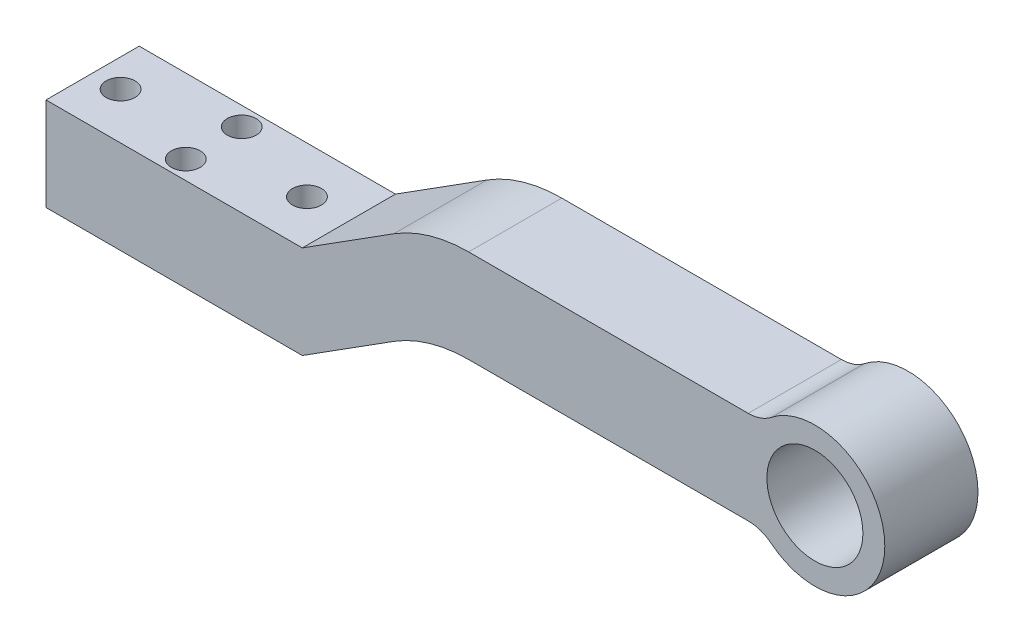
ISO-10303-21;
HEADER;
FILE_DESCRIPTION(('STEP AP214'),'2;1');
FILE_NAME('part.step','',(''),(''),'','','');
FILE_SCHEMA(('AUTOMOTIVE_DESIGN { 1 0 10303 214 1 1 1 1 }'));
ENDSEC;
DATA;
#1=APPLICATION_CONTEXT('core data for automotive mechanical design processes');
#2=APPLICATION_PROTOCOL_DEFINITION('international standard','automotive_design',2000,#1);
#3=PRODUCT_CONTEXT('',#1,'mechanical');
#4=PRODUCT('Part','Part','',(#3));
#5=PRODUCT_RELATED_PRODUCT_CATEGORY('part','',(#4));
#6=PRODUCT_DEFINITION_FORMATION('','',#4);
#7=PRODUCT_DEFINITION_CONTEXT('part definition',#1,'design');
#8=PRODUCT_DEFINITION('design','',#6,#7);
#9=PRODUCT_DEFINITION_SHAPE('','',#8);
#10=(LENGTH_UNIT() NAMED_UNIT(*) SI_UNIT(.MILLI.,.METRE.));
#11=(NAMED_UNIT(*) PLANE_ANGLE_UNIT() SI_UNIT($,.RADIAN.));
#12=(NAMED_UNIT(*) SI_UNIT($,.STERADIAN.) SOLID_ANGLE_UNIT());
#13=UNCERTAINTY_MEASURE_WITH_UNIT(LENGTH_MEASURE(1.E-05),#10,'distance_accuracy_value','');
#14=(GEOMETRIC_REPRESENTATION_CONTEXT(3) GLOBAL_UNCERTAINTY_ASSIGNED_CONTEXT((#13)) GLOBAL_UNIT_ASSIGNED_CONTEXT((#10,
#11,#12)) REPRESENTATION_CONTEXT('',''));
#15=CARTESIAN_POINT('',(0.,0.,0.));
#16=DIRECTION('',(0.,0.,1.));
#17=DIRECTION('',(1.,0.,0.));
#18=AXIS2_PLACEMENT_3D('',#15,#16,#17);
#19=CARTESIAN_POINT('',(197.237796850758,292.623912246658,4.));
#20=DIRECTION('',(0.,-1.,0.));
#21=DIRECTION('',(0.,0.,-1.));
#22=AXIS2_PLACEMENT_3D('',#19,#20,#21);
#23=CYLINDRICAL_SURFACE('',#22,1.59999999999999);
#24=CARTESIAN_POINT('',(197.237796850758,270.623912246657,4.));
#25=DIRECTION('',(0.,-1.,0.));
#26=DIRECTION('',(0.,0.,-1.));
#27=AXIS2_PLACEMENT_3D('',#24,#25,#26);
#28=CIRCLE('',#27,1.59999999999999);
#29=CARTESIAN_POINT('',(197.237796850758,270.623912246657,2.40000000000001));
#30=VERTEX_POINT('',#29);
#31=EDGE_CURVE('E205',#30,#30,#28,.T.);
#32=ORIENTED_EDGE('',*,*,#31,.T.);
#33=EDGE_LOOP('',(#32));
#34=FACE_BOUND('',#33,.T.);
#35=CARTESIAN_POINT('',(197.237796850758,281.623912246657,4.));
#36=DIRECTION('',(0.,1.,0.));
#37=DIRECTION('',(0.,0.,1.));
#38=AXIS2_PLACEMENT_3D('',#35,#36,#37);
#39=CIRCLE('',#38,1.59999999999999);
#40=CARTESIAN_POINT('',(197.237796850758,281.623912246657,5.59999999999999));
#41=VERTEX_POINT('',#40);
#42=EDGE_CURVE('E213',#41,#41,#39,.F.);
#43=ORIENTED_EDGE('',*,*,#42,.F.);
#44=EDGE_LOOP('',(#43));
#45=FACE_BOUND('',#44,.T.);
#46=ADVANCED_FACE('F35',(#34,#45),#23,.F.);
#47=CARTESIAN_POINT('',(197.237796850758,292.623912246658,16.));
#48=DIRECTION('',(0.,-1.,0.));
#49=DIRECTION('',(0.,0.,-1.));
#50=AXIS2_PLACEMENT_3D('',#47,#48,#49);
#51=CYLINDRICAL_SURFACE('',#50,1.59999999999999);
#52=CARTESIAN_POINT('',(197.237796850758,270.623912246657,16.));
#53=DIRECTION('',(0.,-1.,0.));
#54=DIRECTION('',(0.,0.,-1.));
#55=AXIS2_PLACEMENT_3D('',#52,#53,#54);
#56=CIRCLE('',#55,1.59999999999999);
#57=CARTESIAN_POINT('',(197.237796850758,270.623912246657,14.4));
#58=VERTEX_POINT('',#57);
#59=EDGE_CURVE('E230',#58,#58,#56,.T.);
#60=ORIENTED_EDGE('',*,*,#59,.T.);
#61=EDGE_LOOP('',(#60));
#62=FACE_BOUND('',#61,.T.);
#63=CARTESIAN_POINT('',(197.237796850758,281.623912246657,16.));
#64=DIRECTION('',(0.,1.,0.));
#65=DIRECTION('',(0.,0.,1.));
#66=AXIS2_PLACEMENT_3D('',#63,#64,#65);
#67=CIRCLE('',#66,1.59999999999999);
#68=CARTESIAN_POINT('',(197.237796850758,281.623912246657,17.6));
#69=VERTEX_POINT('',#68);
#70=EDGE_CURVE('E210',#69,#69,#67,.F.);
#71=ORIENTED_EDGE('',*,*,#70,.F.);
#72=EDGE_LOOP('',(#71));
#73=FACE_BOUND('',#72,.T.);
#74=ADVANCED_FACE('F307',(#62,#73),#51,.F.);
#75=CARTESIAN_POINT('',(217.237796850758,292.623912246658,10.));
#76=DIRECTION('',(0.,-1.,0.));
#77=DIRECTION('',(0.,0.,-1.));
#78=AXIS2_PLACEMENT_3D('',#75,#76,#77);
#79=CYLINDRICAL_SURFACE('',#78,1.59999999999999);
#80=CARTESIAN_POINT('',(217.237796850758,270.623912246657,10.));
#81=DIRECTION('',(0.,-1.,0.));
#82=DIRECTION('',(0.,0.,-1.));
#83=AXIS2_PLACEMENT_3D('',#80,#81,#82);
#84=CIRCLE('',#83,1.59999999999999);
#85=CARTESIAN_POINT('',(217.237796850758,270.623912246657,8.40000000000002));
#86=VERTEX_POINT('',#85);
#87=EDGE_CURVE('E226',#86,#86,#84,.T.);
#88=ORIENTED_EDGE('',*,*,#87,.T.);
#89=EDGE_LOOP('',(#88));
#90=FACE_BOUND('',#89,.T.);
#91=CARTESIAN_POINT('',(217.237796850758,281.623912246657,10.));
#92=DIRECTION('',(0.,1.,0.));
#93=DIRECTION('',(0.,0.,1.));
#94=AXIS2_PLACEMENT_3D('',#91,#92,#93);
#95=CIRCLE('',#94,1.59999999999999);
#96=CARTESIAN_POINT('',(217.237796850758,281.623912246657,11.6));
#97=VERTEX_POINT('',#96);
#98=EDGE_CURVE('E207',#97,#97,#95,.F.);
#99=ORIENTED_EDGE('',*,*,#98,.F.);
#100=EDGE_LOOP('',(#99));
#101=FACE_BOUND('',#100,.T.);
#102=ADVANCED_FACE('F313',(#90,#101),#79,.F.);
#103=CARTESIAN_POINT('',(177.237796850758,292.623912246658,10.));
#104=DIRECTION('',(0.,-1.,0.));
#105=DIRECTION('',(0.,0.,-1.));
#106=AXIS2_PLACEMENT_3D('',#103,#104,#105);
#107=CYLINDRICAL_SURFACE('',#106,1.59999999999999);
#108=CARTESIAN_POINT('',(177.237796850758,270.623912246657,10.));
#109=DIRECTION('',(0.,-1.,0.));
#110=DIRECTION('',(0.,0.,-1.));
#111=AXIS2_PLACEMENT_3D('',#108,#109,#110);
#112=CIRCLE('',#111,1.59999999999999);
#113=CARTESIAN_POINT('',(177.237796850758,270.623912246657,8.40000000000001));
#114=VERTEX_POINT('',#113);
#115=EDGE_CURVE('E229',#114,#114,#112,.T.);
#116=ORIENTED_EDGE('',*,*,#115,.T.);
#117=EDGE_LOOP('',(#116));
#118=FACE_BOUND('',#117,.T.);
#119=CARTESIAN_POINT('',(177.237796850758,281.623912246657,10.));
#120=DIRECTION('',(0.,1.,0.));
#121=DIRECTION('',(0.,0.,1.));
#122=AXIS2_PLACEMENT_3D('',#119,#120,#121);
#123=CIRCLE('',#122,1.59999999999999);
#124=CARTESIAN_POINT('',(177.237796850758,281.623912246657,11.6));
#125=VERTEX_POINT('',#124);
#126=EDGE_CURVE('E202',#125,#125,#123,.F.);
#127=ORIENTED_EDGE('',*,*,#126,.F.);
#128=EDGE_LOOP('',(#127));
#129=FACE_BOUND('',#128,.T.);
#130=ADVANCED_FACE('F319',(#118,#129),#107,.F.);
#131=CARTESIAN_POINT('',(321.918709695082,279.724919412941,20.));
#132=DIRECTION('',(0.,0.,1.));
#133=DIRECTION('',(1.,0.,0.));
#134=AXIS2_PLACEMENT_3D('',#131,#132,#133);
#135=PLANE('',#134);
#136=DIRECTION('',(0.,1.,0.));
#137=VECTOR('',#136,1.);
#138=CARTESIAN_POINT('',(171.237796850758,268.623912246657,20.));
#139=LINE('',#138,#137);
#140=CARTESIAN_POINT('',(171.237796850758,270.623912246657,20.));
#141=VERTEX_POINT('',#140);
#142=CARTESIAN_POINT('',(171.237796850758,290.623912246657,20.));
#143=VERTEX_POINT('',#142);
#144=EDGE_CURVE('E257',#141,#143,#139,.T.);
#145=ORIENTED_EDGE('',*,*,#144,.F.);
#146=DIRECTION('',(1.,0.,0.));
#147=VECTOR('',#146,1.);
#148=CARTESIAN_POINT('',(168.237796850758,270.623912246657,20.));
#149=LINE('',#148,#147);
#150=CARTESIAN_POINT('',(226.237796850758,270.623912246657,20.));
#151=VERTEX_POINT('',#150);
#152=EDGE_CURVE('E136',#141,#151,#149,.T.);
#153=ORIENTED_EDGE('',*,*,#152,.T.);
#154=DIRECTION('',(0.844667068226223,0.535292017364463,0.));
#155=VECTOR('',#154,1.);
#156=CARTESIAN_POINT('',(245.869173526594,283.064931459728,20.));
#157=LINE('',#156,#155);
#158=CARTESIAN_POINT('',(245.869173526594,283.064931459728,20.));
#159=VERTEX_POINT('',#158);
#160=EDGE_CURVE('E127',#151,#159,#157,.T.);
#161=ORIENTED_EDGE('',*,*,#160,.T.);
#162=CARTESIAN_POINT('',(261.927934047528,257.724919412941,20.));
#163=DIRECTION('',(0.,0.,-1.));
#164=DIRECTION('',(1.,0.,0.));
#165=AXIS2_PLACEMENT_3D('',#162,#163,#164);
#166=CIRCLE('',#165,30.);
#167=CARTESIAN_POINT('',(261.927934047528,287.724919412941,20.));
#168=VERTEX_POINT('',#167);
#169=EDGE_CURVE('E133',#159,#168,#166,.T.);
#170=ORIENTED_EDGE('',*,*,#169,.T.);
#171=DIRECTION('',(1.,0.,0.));
#172=VECTOR('',#171,1.);
#173=CARTESIAN_POINT('',(261.927934047528,287.724919412941,20.));
#174=LINE('',#173,#172);
#175=CARTESIAN_POINT('',(321.918709695082,287.724919412941,20.));
#176=VERTEX_POINT('',#175);
#177=EDGE_CURVE('E58',#168,#176,#174,.T.);
#178=ORIENTED_EDGE('',*,*,#177,.T.);
#179=CARTESIAN_POINT('',(321.918709695082,279.724919412941,20.));
#180=DIRECTION('',(0.,0.,-1.));
#181=DIRECTION('',(1.,0.,0.));
#182=AXIS2_PLACEMENT_3D('',#179,#180,#181);
#183=CIRCLE('',#182,7.99999999999997);
#184=CARTESIAN_POINT('',(326.89926174923,285.985438659451,20.));
#185=VERTEX_POINT('',#184);
#186=EDGE_CURVE('E182',#176,#185,#183,.T.);
#187=ORIENTED_EDGE('',*,*,#186,.T.);
#188=CARTESIAN_POINT('',(336.237796850758,297.723912246657,20.));
#189=DIRECTION('',(0.,0.,1.));
#190=DIRECTION('',(1.,0.,0.));
#191=AXIS2_PLACEMENT_3D('',#188,#189,#190);
#192=CIRCLE('',#191,15.);
#193=CARTESIAN_POINT('',(326.900192078068,309.463125896176,20.));
#194=VERTEX_POINT('',#193);
#195=EDGE_CURVE('E106',#185,#194,#192,.T.);
#196=ORIENTED_EDGE('',*,*,#195,.T.);
#197=CARTESIAN_POINT('',(321.9201361993,315.724039842586,20.));
#198=DIRECTION('',(0.,0.,-1.));
#199=DIRECTION('',(1.,0.,0.));
#200=AXIS2_PLACEMENT_3D('',#197,#198,#199);
#201=CIRCLE('',#200,7.99999999999996);
#202=CARTESIAN_POINT('',(321.920064905189,307.724039842904,20.));
#203=VERTEX_POINT('',#202);
#204=EDGE_CURVE('E244',#194,#203,#201,.T.);
#205=ORIENTED_EDGE('',*,*,#204,.T.);
#206=DIRECTION('',(-0.999999999907708,1.35861492857101E-05,0.));
#207=VECTOR('',#206,1.);
#208=CARTESIAN_POINT('',(261.92823983907,307.724854900795,20.));
#209=LINE('',#208,#207);
#210=CARTESIAN_POINT('',(261.92823983907,307.724854900795,20.));
#211=VERTEX_POINT('',#210);
#212=EDGE_CURVE('E246',#203,#211,#209,.T.);
#213=ORIENTED_EDGE('',*,*,#212,.T.);
#214=CARTESIAN_POINT('',(261.927832254591,277.724854903564,20.));
#215=DIRECTION('',(0.,0.,1.));
#216=DIRECTION('',(1.,0.,0.));
#217=AXIS2_PLACEMENT_3D('',#214,#215,#216);
#218=CIRCLE('',#217,30.);
#219=CARTESIAN_POINT('',(245.869071733657,303.064866950351,20.));
#220=VERTEX_POINT('',#219);
#221=EDGE_CURVE('E248',#211,#220,#218,.T.);
#222=ORIENTED_EDGE('',*,*,#221,.T.);
#223=DIRECTION('',(-0.844667068226223,-0.535292017364463,0.));
#224=VECTOR('',#223,1.);
#225=CARTESIAN_POINT('',(245.869071733657,303.064866950351,20.));
#226=LINE('',#225,#224);
#227=CARTESIAN_POINT('',(226.237796850758,290.623912246657,20.));
#228=VERTEX_POINT('',#227);
#229=EDGE_CURVE('E250',#220,#228,#226,.T.);
#230=ORIENTED_EDGE('',*,*,#229,.T.);
#231=DIRECTION('',(-1.,0.,0.));
#232=VECTOR('',#231,1.);
#233=CARTESIAN_POINT('',(217.532290693283,290.623912246657,20.));
#234=LINE('',#233,#232);
#235=EDGE_CURVE('E252',#228,#143,#234,.T.);
#236=ORIENTED_EDGE('',*,*,#235,.T.);
#237=EDGE_LOOP('',(#145,#153,#161,#170,#178,#187,#196,#205,#213,#222,#230,#236));
#238=FACE_BOUND('',#237,.T.);
#239=CARTESIAN_POINT('',(336.237796850758,297.723912246657,20.));
#240=DIRECTION('',(0.,0.,1.));
#241=DIRECTION('',(1.,0.,0.));
#242=AXIS2_PLACEMENT_3D('',#239,#240,#241);
#243=CIRCLE('',#242,10.3);
#244=CARTESIAN_POINT('',(346.537796850758,297.723912246657,20.));
#245=VERTEX_POINT('',#244);
#246=EDGE_CURVE('E161',#245,#245,#243,.T.);
#247=ORIENTED_EDGE('',*,*,#246,.F.);
#248=EDGE_LOOP('',(#247));
#249=FACE_BOUND('',#248,.T.);
#250=ADVANCED_FACE('F130',(#238,#249),#135,.T.);
#251=CARTESIAN_POINT('',(321.918709695082,279.724919412941,0.));
#252=DIRECTION('',(0.,0.,1.));
#253=DIRECTION('',(1.,0.,0.));
#254=AXIS2_PLACEMENT_3D('',#251,#252,#253);
#255=PLANE('',#254);
#256=DIRECTION('',(1.,0.,0.));
#257=VECTOR('',#256,1.);
#258=CARTESIAN_POINT('',(168.237796850758,270.623912246657,0.));
#259=LINE('',#258,#257);
#260=CARTESIAN_POINT('',(171.237796850758,270.623912246657,0.));
#261=VERTEX_POINT('',#260);
#262=CARTESIAN_POINT('',(226.237796850758,270.623912246657,0.));
#263=VERTEX_POINT('',#262);
#264=EDGE_CURVE('E176',#261,#263,#259,.T.);
#265=ORIENTED_EDGE('',*,*,#264,.F.);
#266=DIRECTION('',(0.,1.,0.));
#267=VECTOR('',#266,1.);
#268=CARTESIAN_POINT('',(171.237796850758,268.623912246657,0.));
#269=LINE('',#268,#267);
#270=CARTESIAN_POINT('',(171.237796850758,290.623912246657,0.));
#271=VERTEX_POINT('',#270);
#272=EDGE_CURVE('E50',#261,#271,#269,.T.);
#273=ORIENTED_EDGE('',*,*,#272,.T.);
#274=DIRECTION('',(-1.,0.,0.));
#275=VECTOR('',#274,1.);
#276=CARTESIAN_POINT('',(168.237796850758,290.623912246657,0.));
#277=LINE('',#276,#275);
#278=CARTESIAN_POINT('',(226.237796850758,290.623912246657,0.));
#279=VERTEX_POINT('',#278);
#280=EDGE_CURVE('E173',#279,#271,#277,.T.);
#281=ORIENTED_EDGE('',*,*,#280,.F.);
#282=DIRECTION('',(-0.844667068226222,-0.535292017364465,0.));
#283=VECTOR('',#282,1.);
#284=CARTESIAN_POINT('',(233.591051214217,295.283900199871,0.));
#285=LINE('',#284,#283);
#286=CARTESIAN_POINT('',(245.869071733657,303.064866950351,0.));
#287=VERTEX_POINT('',#286);
#288=EDGE_CURVE('E170',#287,#279,#285,.T.);
#289=ORIENTED_EDGE('',*,*,#288,.F.);
#290=CARTESIAN_POINT('',(261.927832254591,277.724854903564,0.));
#291=DIRECTION('',(0.,0.,1.));
#292=DIRECTION('',(1.,0.,0.));
#293=AXIS2_PLACEMENT_3D('',#290,#291,#292);
#294=CIRCLE('',#293,30.);
#295=CARTESIAN_POINT('',(261.92823983907,307.724854900795,0.));
#296=VERTEX_POINT('',#295);
#297=EDGE_CURVE('E167',#296,#287,#294,.T.);
#298=ORIENTED_EDGE('',*,*,#297,.F.);
#299=DIRECTION('',(-0.999999999907708,1.35861492857101E-05,0.));
#300=VECTOR('',#299,1.);
#301=CARTESIAN_POINT('',(261.92823983907,307.724854900795,0.));
#302=LINE('',#301,#300);
#303=CARTESIAN_POINT('',(321.920064905189,307.724039842904,0.));
#304=VERTEX_POINT('',#303);
#305=EDGE_CURVE('E165',#304,#296,#302,.T.);
#306=ORIENTED_EDGE('',*,*,#305,.F.);
#307=CARTESIAN_POINT('',(321.9201361993,315.724039842586,0.));
#308=DIRECTION('',(0.,0.,-1.));
#309=DIRECTION('',(1.,0.,0.));
#310=AXIS2_PLACEMENT_3D('',#307,#308,#309);
#311=CIRCLE('',#310,7.99999999999996);
#312=CARTESIAN_POINT('',(326.900192078068,309.463125896176,0.));
#313=VERTEX_POINT('',#312);
#314=EDGE_CURVE('E163',#313,#304,#311,.T.);
#315=ORIENTED_EDGE('',*,*,#314,.F.);
#316=CARTESIAN_POINT('',(336.237796850758,297.723912246657,0.));
#317=DIRECTION('',(0.,0.,1.));
#318=DIRECTION('',(1.,0.,0.));
#319=AXIS2_PLACEMENT_3D('',#316,#317,#318);
#320=CIRCLE('',#319,15.);
#321=CARTESIAN_POINT('',(326.89926174923,285.985438659451,0.));
#322=VERTEX_POINT('',#321);
#323=EDGE_CURVE('E160',#322,#313,#320,.T.);
#324=ORIENTED_EDGE('',*,*,#323,.F.);
#325=CARTESIAN_POINT('',(321.918709695082,279.724919412941,0.));
#326=DIRECTION('',(0.,0.,-1.));
#327=DIRECTION('',(1.,0.,0.));
#328=AXIS2_PLACEMENT_3D('',#325,#326,#327);
#329=CIRCLE('',#328,7.99999999999997);
#330=CARTESIAN_POINT('',(321.918709695082,287.724919412941,0.));
#331=VERTEX_POINT('',#330);
#332=EDGE_CURVE('E157',#331,#322,#329,.T.);
#333=ORIENTED_EDGE('',*,*,#332,.F.);
#334=DIRECTION('',(1.,0.,0.));
#335=VECTOR('',#334,1.);
#336=CARTESIAN_POINT('',(261.927934047528,287.724919412941,0.));
#337=LINE('',#336,#335);
#338=CARTESIAN_POINT('',(261.927934047528,287.724919412941,0.));
#339=VERTEX_POINT('',#338);
#340=EDGE_CURVE('E97',#339,#331,#337,.T.);
#341=ORIENTED_EDGE('',*,*,#340,.F.);
#342=CARTESIAN_POINT('',(261.927934047528,257.724919412941,0.));
#343=DIRECTION('',(0.,0.,-1.));
#344=DIRECTION('',(1.,0.,0.));
#345=AXIS2_PLACEMENT_3D('',#342,#343,#344);
#346=CIRCLE('',#345,30.);
#347=CARTESIAN_POINT('',(245.869173526594,283.064931459728,0.));
#348=VERTEX_POINT('',#347);
#349=EDGE_CURVE('E179',#348,#339,#346,.T.);
#350=ORIENTED_EDGE('',*,*,#349,.F.);
#351=DIRECTION('',(0.844667068226223,0.535292017364463,0.));
#352=VECTOR('',#351,1.);
#353=CARTESIAN_POINT('',(245.869173526594,283.064931459728,0.));
#354=LINE('',#353,#352);
#355=EDGE_CURVE('E145',#263,#348,#354,.T.);
#356=ORIENTED_EDGE('',*,*,#355,.F.);
#357=EDGE_LOOP('',(#265,#273,#281,#289,#298,#306,#315,#324,#333,#341,#350,#356));
#358=FACE_BOUND('',#357,.T.);
#359=CARTESIAN_POINT('',(336.237796850758,297.723912246657,0.));
#360=DIRECTION('',(0.,0.,1.));
#361=DIRECTION('',(1.,0.,0.));
#362=AXIS2_PLACEMENT_3D('',#359,#360,#361);
#363=CIRCLE('',#362,10.3);
#364=CARTESIAN_POINT('',(346.537796850758,297.723912246657,0.));
#365=VERTEX_POINT('',#364);
#366=EDGE_CURVE('E237',#365,#365,#363,.T.);
#367=ORIENTED_EDGE('',*,*,#366,.T.);
#368=EDGE_LOOP('',(#367));
#369=FACE_BOUND('',#368,.T.);
#370=ADVANCED_FACE('F331',(#358,#369),#255,.F.);
#371=CARTESIAN_POINT('',(321.918709695082,279.724919412941,20.));
#372=DIRECTION('',(0.,0.,-1.));
#373=DIRECTION('',(-1.,0.,0.));
#374=AXIS2_PLACEMENT_3D('',#371,#372,#373);
#375=CYLINDRICAL_SURFACE('',#374,7.99999999999997);
#376=ORIENTED_EDGE('',*,*,#332,.T.);
#377=DIRECTION('',(0.,0.,-1.));
#378=VECTOR('',#377,1.);
#379=CARTESIAN_POINT('',(326.89926174923,285.985438659451,20.));
#380=LINE('',#379,#378);
#381=EDGE_CURVE('E43',#185,#322,#380,.T.);
#382=ORIENTED_EDGE('',*,*,#381,.F.);
#383=ORIENTED_EDGE('',*,*,#186,.F.);
#384=DIRECTION('',(0.,0.,-1.));
#385=VECTOR('',#384,1.);
#386=CARTESIAN_POINT('',(321.918709695082,287.724919412941,20.));
#387=LINE('',#386,#385);
#388=EDGE_CURVE('E153',#176,#331,#387,.T.);
#389=ORIENTED_EDGE('',*,*,#388,.T.);
#390=EDGE_LOOP('',(#376,#382,#383,#389));
#391=FACE_BOUND('',#390,.T.);
#392=ADVANCED_FACE('F37',(#391),#375,.F.);
#393=CARTESIAN_POINT('',(336.237796850758,297.723912246657,20.));
#394=DIRECTION('',(0.,0.,-1.));
#395=DIRECTION('',(-1.,0.,0.));
#396=AXIS2_PLACEMENT_3D('',#393,#394,#395);
#397=CYLINDRICAL_SURFACE('',#396,15.);
#398=ORIENTED_EDGE('',*,*,#323,.T.);
#399=DIRECTION('',(0.,0.,-1.));
#400=VECTOR('',#399,1.);
#401=CARTESIAN_POINT('',(326.900192078068,309.463125896176,20.));
#402=LINE('',#401,#400);
#403=EDGE_CURVE('E198',#194,#313,#402,.T.);
#404=ORIENTED_EDGE('',*,*,#403,.F.);
#405=ORIENTED_EDGE('',*,*,#195,.F.);
#406=ORIENTED_EDGE('',*,*,#381,.T.);
#407=EDGE_LOOP('',(#398,#404,#405,#406));
#408=FACE_BOUND('',#407,.T.);
#409=ADVANCED_FACE('F520',(#408),#397,.T.);
#410=CARTESIAN_POINT('',(321.9201361993,315.724039842586,20.));
#411=DIRECTION('',(0.,0.,-1.));
#412=DIRECTION('',(-1.,0.,0.));
#413=AXIS2_PLACEMENT_3D('',#410,#411,#412);
#414=CYLINDRICAL_SURFACE('',#413,7.99999999999996);
#415=ORIENTED_EDGE('',*,*,#314,.T.);
#416=DIRECTION('',(0.,0.,-1.));
#417=VECTOR('',#416,1.);
#418=CARTESIAN_POINT('',(321.920064905189,307.724039842904,20.));
#419=LINE('',#418,#417);
#420=EDGE_CURVE('E195',#203,#304,#419,.T.);
#421=ORIENTED_EDGE('',*,*,#420,.F.);
#422=ORIENTED_EDGE('',*,*,#204,.F.);
#423=ORIENTED_EDGE('',*,*,#403,.T.);
#424=EDGE_LOOP('',(#415,#421,#422,#423));
#425=FACE_BOUND('',#424,.T.);
#426=ADVANCED_FACE('F523',(#425),#414,.F.);
#427=CARTESIAN_POINT('',(261.92823983907,307.724854900795,20.));
#428=DIRECTION('',(-1.35861492857101E-05,-0.999999999907708,0.));
#429=DIRECTION('',(0.999999999907708,-1.35861492857101E-05,0.));
#430=AXIS2_PLACEMENT_3D('',#427,#428,#429);
#431=PLANE('',#430);
#432=ORIENTED_EDGE('',*,*,#305,.T.);
#433=DIRECTION('',(0.,0.,-1.));
#434=VECTOR('',#433,1.);
#435=CARTESIAN_POINT('',(261.92823983907,307.724854900795,20.));
#436=LINE('',#435,#434);
#437=EDGE_CURVE('E192',#211,#296,#436,.T.);
#438=ORIENTED_EDGE('',*,*,#437,.F.);
#439=ORIENTED_EDGE('',*,*,#212,.F.);
#440=ORIENTED_EDGE('',*,*,#420,.T.);
#441=EDGE_LOOP('',(#432,#438,#439,#440));
#442=FACE_BOUND('',#441,.T.);
#443=ADVANCED_FACE('F528',(#442),#431,.F.);
#444=CARTESIAN_POINT('',(261.927832254591,277.724854903564,20.));
#445=DIRECTION('',(0.,0.,-1.));
#446=DIRECTION('',(-1.,0.,0.));
#447=AXIS2_PLACEMENT_3D('',#444,#445,#446);
#448=CYLINDRICAL_SURFACE('',#447,30.);
#449=ORIENTED_EDGE('',*,*,#297,.T.);
#450=DIRECTION('',(0.,0.,-1.));
#451=VECTOR('',#450,1.);
#452=CARTESIAN_POINT('',(245.869071733657,303.064866950351,20.));
#453=LINE('',#452,#451);
#454=EDGE_CURVE('E189',#220,#287,#453,.T.);
#455=ORIENTED_EDGE('',*,*,#454,.F.);
#456=ORIENTED_EDGE('',*,*,#221,.F.);
#457=ORIENTED_EDGE('',*,*,#437,.T.);
#458=EDGE_LOOP('',(#449,#455,#456,#457));
#459=FACE_BOUND('',#458,.T.);
#460=ADVANCED_FACE('F301',(#459),#448,.T.);
#461=CARTESIAN_POINT('',(233.591051214217,295.283900199871,20.));
#462=DIRECTION('',(0.535292017364465,-0.844667068226222,0.));
#463=DIRECTION('',(0.844667068226222,0.535292017364465,0.));
#464=AXIS2_PLACEMENT_3D('',#461,#462,#463);
#465=PLANE('',#464);
#466=ORIENTED_EDGE('',*,*,#288,.T.);
#467=DIRECTION('',(0.,0.,-1.));
#468=VECTOR('',#467,1.);
#469=CARTESIAN_POINT('',(226.237796850758,290.623912246657,20.));
#470=LINE('',#469,#468);
#471=EDGE_CURVE('E186',#228,#279,#470,.T.);
#472=ORIENTED_EDGE('',*,*,#471,.F.);
#473=ORIENTED_EDGE('',*,*,#229,.F.);
#474=ORIENTED_EDGE('',*,*,#454,.T.);
#475=EDGE_LOOP('',(#466,#472,#473,#474));
#476=FACE_BOUND('',#475,.T.);
#477=ADVANCED_FACE('F292',(#476),#465,.F.);
#478=CARTESIAN_POINT('',(168.237796850758,290.623912246657,20.));
#479=DIRECTION('',(0.,-1.,0.));
#480=DIRECTION('',(0.,0.,-1.));
#481=AXIS2_PLACEMENT_3D('',#478,#479,#480);
#482=PLANE('',#481);
#483=CARTESIAN_POINT('',(217.237796850758,290.623912246657,10.));
#484=DIRECTION('',(0.,1.,0.));
#485=DIRECTION('',(0.,0.,1.));
#486=AXIS2_PLACEMENT_3D('',#483,#484,#485);
#487=CIRCLE('',#486,3.09999999999999);
#488=CARTESIAN_POINT('',(217.237796850758,290.623912246657,13.1));
#489=VERTEX_POINT('',#488);
#490=EDGE_CURVE('E269',#489,#489,#487,.T.);
#491=ORIENTED_EDGE('',*,*,#490,.F.);
#492=EDGE_LOOP('',(#491));
#493=FACE_BOUND('',#492,.T.);
#494=CARTESIAN_POINT('',(197.237796850758,290.623912246657,4.));
#495=DIRECTION('',(0.,1.,0.));
#496=DIRECTION('',(0.,0.,1.));
#497=AXIS2_PLACEMENT_3D('',#494,#495,#496);
#498=CIRCLE('',#497,3.09999999999999);
#499=CARTESIAN_POINT('',(197.237796850758,290.623912246657,7.09999999999999));
#500=VERTEX_POINT('',#499);
#501=EDGE_CURVE('E275',#500,#500,#498,.T.);
#502=ORIENTED_EDGE('',*,*,#501,.F.);
#503=EDGE_LOOP('',(#502));
#504=FACE_BOUND('',#503,.T.);
#505=CARTESIAN_POINT('',(197.237796850758,290.623912246657,16.));
#506=DIRECTION('',(0.,1.,0.));
#507=DIRECTION('',(0.,0.,1.));
#508=AXIS2_PLACEMENT_3D('',#505,#506,#507);
#509=CIRCLE('',#508,3.09999999999999);
#510=CARTESIAN_POINT('',(197.237796850758,290.623912246657,19.1));
#511=VERTEX_POINT('',#510);
#512=EDGE_CURVE('E274',#511,#511,#509,.T.);
#513=ORIENTED_EDGE('',*,*,#512,.F.);
#514=EDGE_LOOP('',(#513));
#515=FACE_BOUND('',#514,.T.);
#516=CARTESIAN_POINT('',(177.237796850758,290.623912246657,10.));
#517=DIRECTION('',(0.,1.,0.));
#518=DIRECTION('',(0.,0.,1.));
#519=AXIS2_PLACEMENT_3D('',#516,#517,#518);
#520=CIRCLE('',#519,3.10000000000002);
#521=CARTESIAN_POINT('',(177.237796850758,290.623912246657,13.1));
#522=VERTEX_POINT('',#521);
#523=EDGE_CURVE('E215',#522,#522,#520,.T.);
#524=ORIENTED_EDGE('',*,*,#523,.F.);
#525=EDGE_LOOP('',(#524));
#526=FACE_BOUND('',#525,.T.);
#527=ORIENTED_EDGE('',*,*,#280,.T.);
#528=DIRECTION('',(0.,0.,-1.));
#529=VECTOR('',#528,1.);
#530=CARTESIAN_POINT('',(171.237796850758,290.623912246657,20.));
#531=LINE('',#530,#529);
#532=EDGE_CURVE('E265',#143,#271,#531,.T.);
#533=ORIENTED_EDGE('',*,*,#532,.F.);
#534=ORIENTED_EDGE('',*,*,#235,.F.);
#535=ORIENTED_EDGE('',*,*,#471,.T.);
#536=EDGE_LOOP('',(#527,#533,#534,#535));
#537=FACE_BOUND('',#536,.T.);
#538=ADVANCED_FACE('F264',(#493,#504,#515,#526,#537),#482,.F.);
#539=CARTESIAN_POINT('',(168.237796850758,270.623912246657,20.));
#540=DIRECTION('',(0.,1.,0.));
#541=DIRECTION('',(0.,0.,1.));
#542=AXIS2_PLACEMENT_3D('',#539,#540,#541);
#543=PLANE('',#542);
#544=ORIENTED_EDGE('',*,*,#87,.F.);
#545=EDGE_LOOP('',(#544));
#546=FACE_BOUND('',#545,.T.);
#547=ORIENTED_EDGE('',*,*,#59,.F.);
#548=EDGE_LOOP('',(#547));
#549=FACE_BOUND('',#548,.T.);
#550=ORIENTED_EDGE('',*,*,#31,.F.);
#551=EDGE_LOOP('',(#550));
#552=FACE_BOUND('',#551,.T.);
#553=ORIENTED_EDGE('',*,*,#115,.F.);
#554=EDGE_LOOP('',(#553));
#555=FACE_BOUND('',#554,.T.);
#556=ORIENTED_EDGE('',*,*,#152,.F.);
#557=DIRECTION('',(0.,0.,-1.));
#558=VECTOR('',#557,1.);
#559=CARTESIAN_POINT('',(171.237796850758,270.623912246657,20.));
#560=LINE('',#559,#558);
#561=EDGE_CURVE('E11',#141,#261,#560,.T.);
#562=ORIENTED_EDGE('',*,*,#561,.T.);
#563=ORIENTED_EDGE('',*,*,#264,.T.);
#564=DIRECTION('',(0.,0.,-1.));
#565=VECTOR('',#564,1.);
#566=CARTESIAN_POINT('',(226.237796850758,270.623912246657,20.));
#567=LINE('',#566,#565);
#568=EDGE_CURVE('E148',#151,#263,#567,.T.);
#569=ORIENTED_EDGE('',*,*,#568,.F.);
#570=EDGE_LOOP('',(#556,#562,#563,#569));
#571=FACE_BOUND('',#570,.T.);
#572=ADVANCED_FACE('F291',(#546,#549,#552,#555,#571),#543,.F.);
#573=CARTESIAN_POINT('',(245.869173526594,283.064931459728,20.));
#574=DIRECTION('',(-0.535292017364463,0.844667068226223,0.));
#575=DIRECTION('',(-0.844667068226223,-0.535292017364463,0.));
#576=AXIS2_PLACEMENT_3D('',#573,#574,#575);
#577=PLANE('',#576);
#578=ORIENTED_EDGE('',*,*,#355,.T.);
#579=DIRECTION('',(0.,0.,-1.));
#580=VECTOR('',#579,1.);
#581=CARTESIAN_POINT('',(245.869173526594,283.064931459728,20.));
#582=LINE('',#581,#580);
#583=EDGE_CURVE('E142',#159,#348,#582,.T.);
#584=ORIENTED_EDGE('',*,*,#583,.F.);
#585=ORIENTED_EDGE('',*,*,#160,.F.);
#586=ORIENTED_EDGE('',*,*,#568,.T.);
#587=EDGE_LOOP('',(#578,#584,#585,#586));
#588=FACE_BOUND('',#587,.T.);
#589=ADVANCED_FACE('F143',(#588),#577,.F.);
#590=CARTESIAN_POINT('',(261.927934047528,257.724919412941,20.));
#591=DIRECTION('',(0.,0.,-1.));
#592=DIRECTION('',(-1.,0.,0.));
#593=AXIS2_PLACEMENT_3D('',#590,#591,#592);
#594=CYLINDRICAL_SURFACE('',#593,30.);
#595=ORIENTED_EDGE('',*,*,#349,.T.);
#596=DIRECTION('',(0.,0.,-1.));
#597=VECTOR('',#596,1.);
#598=CARTESIAN_POINT('',(261.927934047528,287.724919412941,20.));
#599=LINE('',#598,#597);
#600=EDGE_CURVE('E149',#168,#339,#599,.T.);
#601=ORIENTED_EDGE('',*,*,#600,.F.);
#602=ORIENTED_EDGE('',*,*,#169,.F.);
#603=ORIENTED_EDGE('',*,*,#583,.T.);
#604=EDGE_LOOP('',(#595,#601,#602,#603));
#605=FACE_BOUND('',#604,.T.);
#606=ADVANCED_FACE('F151',(#605),#594,.F.);
#607=CARTESIAN_POINT('',(261.927934047528,287.724919412941,20.));
#608=DIRECTION('',(0.,1.,0.));
#609=DIRECTION('',(0.,0.,1.));
#610=AXIS2_PLACEMENT_3D('',#607,#608,#609);
#611=PLANE('',#610);
#612=ORIENTED_EDGE('',*,*,#340,.T.);
#613=ORIENTED_EDGE('',*,*,#388,.F.);
#614=ORIENTED_EDGE('',*,*,#177,.F.);
#615=ORIENTED_EDGE('',*,*,#600,.T.);
#616=EDGE_LOOP('',(#612,#613,#614,#615));
#617=FACE_BOUND('',#616,.T.);
#618=ADVANCED_FACE('F327',(#617),#611,.F.);
#619=CARTESIAN_POINT('',(336.237796850758,297.723912246657,20.));
#620=DIRECTION('',(0.,0.,-1.));
#621=DIRECTION('',(-1.,0.,0.));
#622=AXIS2_PLACEMENT_3D('',#619,#620,#621);
#623=CYLINDRICAL_SURFACE('',#622,10.3);
#624=ORIENTED_EDGE('',*,*,#246,.T.);
#625=EDGE_LOOP('',(#624));
#626=FACE_BOUND('',#625,.T.);
#627=ORIENTED_EDGE('',*,*,#366,.F.);
#628=EDGE_LOOP('',(#627));
#629=FACE_BOUND('',#628,.T.);
#630=ADVANCED_FACE('F323',(#626,#629),#623,.F.);
#631=CARTESIAN_POINT('',(177.237796850758,281.623912246657,10.));
#632=DIRECTION('',(0.,1.,0.));
#633=DIRECTION('',(0.,0.,1.));
#634=AXIS2_PLACEMENT_3D('',#631,#632,#633);
#635=PLANE('',#634);
#636=CARTESIAN_POINT('',(177.237796850758,281.623912246657,10.));
#637=DIRECTION('',(0.,1.,0.));
#638=DIRECTION('',(0.,0.,1.));
#639=AXIS2_PLACEMENT_3D('',#636,#637,#638);
#640=CIRCLE('',#639,3.10000000000002);
#641=CARTESIAN_POINT('',(177.237796850758,281.623912246657,13.1));
#642=VERTEX_POINT('',#641);
#643=EDGE_CURVE('E206',#642,#642,#640,.T.);
#644=ORIENTED_EDGE('',*,*,#643,.T.);
#645=EDGE_LOOP('',(#644));
#646=FACE_BOUND('',#645,.T.);
#647=ORIENTED_EDGE('',*,*,#126,.T.);
#648=EDGE_LOOP('',(#647));
#649=FACE_BOUND('',#648,.T.);
#650=ADVANCED_FACE('F326',(#646,#649),#635,.T.);
#651=CARTESIAN_POINT('',(177.237796850758,281.623912246657,10.));
#652=DIRECTION('',(0.,1.,0.));
#653=DIRECTION('',(0.,0.,1.));
#654=AXIS2_PLACEMENT_3D('',#651,#652,#653);
#655=CYLINDRICAL_SURFACE('',#654,3.10000000000002);
#656=ORIENTED_EDGE('',*,*,#643,.F.);
#657=EDGE_LOOP('',(#656));
#658=FACE_BOUND('',#657,.T.);
#659=ORIENTED_EDGE('',*,*,#523,.T.);
#660=EDGE_LOOP('',(#659));
#661=FACE_BOUND('',#660,.T.);
#662=ADVANCED_FACE('F363',(#658,#661),#655,.F.);
#663=CARTESIAN_POINT('',(217.237796850758,281.623912246657,10.));
#664=DIRECTION('',(0.,1.,0.));
#665=DIRECTION('',(0.,0.,1.));
#666=AXIS2_PLACEMENT_3D('',#663,#664,#665);
#667=PLANE('',#666);
#668=CARTESIAN_POINT('',(217.237796850758,281.623912246657,10.));
#669=DIRECTION('',(0.,1.,0.));
#670=DIRECTION('',(0.,0.,1.));
#671=AXIS2_PLACEMENT_3D('',#668,#669,#670);
#672=CIRCLE('',#671,3.09999999999999);
#673=CARTESIAN_POINT('',(217.237796850758,281.623912246657,13.1));
#674=VERTEX_POINT('',#673);
#675=EDGE_CURVE('E278',#674,#674,#672,.T.);
#676=ORIENTED_EDGE('',*,*,#675,.T.);
#677=EDGE_LOOP('',(#676));
#678=FACE_BOUND('',#677,.T.);
#679=ORIENTED_EDGE('',*,*,#98,.T.);
#680=EDGE_LOOP('',(#679));
#681=FACE_BOUND('',#680,.T.);
#682=ADVANCED_FACE('F372',(#678,#681),#667,.T.);
#683=CARTESIAN_POINT('',(217.237796850758,281.623912246657,10.));
#684=DIRECTION('',(0.,1.,0.));
#685=DIRECTION('',(0.,0.,1.));
#686=AXIS2_PLACEMENT_3D('',#683,#684,#685);
#687=CYLINDRICAL_SURFACE('',#686,3.09999999999999);
#688=ORIENTED_EDGE('',*,*,#675,.F.);
#689=EDGE_LOOP('',(#688));
#690=FACE_BOUND('',#689,.T.);
#691=ORIENTED_EDGE('',*,*,#490,.T.);
#692=EDGE_LOOP('',(#691));
#693=FACE_BOUND('',#692,.T.);
#694=ADVANCED_FACE('F380',(#690,#693),#687,.F.);
#695=CARTESIAN_POINT('',(197.237796850758,281.623912246657,16.));
#696=DIRECTION('',(0.,1.,0.));
#697=DIRECTION('',(0.,0.,1.));
#698=AXIS2_PLACEMENT_3D('',#695,#696,#697);
#699=PLANE('',#698);
#700=CARTESIAN_POINT('',(197.237796850758,281.623912246657,16.));
#701=DIRECTION('',(0.,1.,0.));
#702=DIRECTION('',(0.,0.,1.));
#703=AXIS2_PLACEMENT_3D('',#700,#701,#702);
#704=CIRCLE('',#703,3.09999999999999);
#705=CARTESIAN_POINT('',(197.237796850758,281.623912246657,19.1));
#706=VERTEX_POINT('',#705);
#707=EDGE_CURVE('E211',#706,#706,#704,.T.);
#708=ORIENTED_EDGE('',*,*,#707,.T.);
#709=EDGE_LOOP('',(#708));
#710=FACE_BOUND('',#709,.T.);
#711=ORIENTED_EDGE('',*,*,#70,.T.);
#712=EDGE_LOOP('',(#711));
#713=FACE_BOUND('',#712,.T.);
#714=ADVANCED_FACE('F388',(#710,#713),#699,.T.);
#715=CARTESIAN_POINT('',(197.237796850758,281.623912246657,16.));
#716=DIRECTION('',(0.,1.,0.));
#717=DIRECTION('',(0.,0.,1.));
#718=AXIS2_PLACEMENT_3D('',#715,#716,#717);
#719=CYLINDRICAL_SURFACE('',#718,3.09999999999999);
#720=ORIENTED_EDGE('',*,*,#707,.F.);
#721=EDGE_LOOP('',(#720));
#722=FACE_BOUND('',#721,.T.);
#723=ORIENTED_EDGE('',*,*,#512,.T.);
#724=EDGE_LOOP('',(#723));
#725=FACE_BOUND('',#724,.T.);
#726=ADVANCED_FACE('F287',(#722,#725),#719,.F.);
#727=CARTESIAN_POINT('',(197.237796850758,281.623912246657,4.));
#728=DIRECTION('',(0.,1.,0.));
#729=DIRECTION('',(0.,0.,1.));
#730=AXIS2_PLACEMENT_3D('',#727,#728,#729);
#731=PLANE('',#730);
#732=CARTESIAN_POINT('',(197.237796850758,281.623912246657,4.));
#733=DIRECTION('',(0.,1.,0.));
#734=DIRECTION('',(0.,0.,1.));
#735=AXIS2_PLACEMENT_3D('',#732,#733,#734);
#736=CIRCLE('',#735,3.09999999999999);
#737=CARTESIAN_POINT('',(197.237796850758,281.623912246657,7.09999999999999));
#738=VERTEX_POINT('',#737);
#739=EDGE_CURVE('E271',#738,#738,#736,.T.);
#740=ORIENTED_EDGE('',*,*,#739,.T.);
#741=EDGE_LOOP('',(#740));
#742=FACE_BOUND('',#741,.T.);
#743=ORIENTED_EDGE('',*,*,#42,.T.);
#744=EDGE_LOOP('',(#743));
#745=FACE_BOUND('',#744,.T.);
#746=ADVANCED_FACE('F403',(#742,#745),#731,.T.);
#747=CARTESIAN_POINT('',(197.237796850758,281.623912246657,4.));
#748=DIRECTION('',(0.,1.,0.));
#749=DIRECTION('',(0.,0.,1.));
#750=AXIS2_PLACEMENT_3D('',#747,#748,#749);
#751=CYLINDRICAL_SURFACE('',#750,3.09999999999999);
#752=ORIENTED_EDGE('',*,*,#739,.F.);
#753=EDGE_LOOP('',(#752));
#754=FACE_BOUND('',#753,.T.);
#755=ORIENTED_EDGE('',*,*,#501,.T.);
#756=EDGE_LOOP('',(#755));
#757=FACE_BOUND('',#756,.T.);
#758=ADVANCED_FACE('F411',(#754,#757),#751,.F.);
#759=CARTESIAN_POINT('',(171.237796850758,268.623912246657,20.));
#760=DIRECTION('',(1.,0.,0.));
#761=DIRECTION('',(0.,0.,-1.));
#762=AXIS2_PLACEMENT_3D('',#759,#760,#761);
#763=PLANE('',#762);
#764=ORIENTED_EDGE('',*,*,#144,.T.);
#765=ORIENTED_EDGE('',*,*,#532,.T.);
#766=ORIENTED_EDGE('',*,*,#272,.F.);
#767=ORIENTED_EDGE('',*,*,#561,.F.);
#768=EDGE_LOOP('',(#764,#765,#766,#767));
#769=FACE_BOUND('',#768,.T.);
#770=ADVANCED_FACE('F419',(#769),#763,.F.);
#771=CLOSED_SHELL('',(#46,#74,#102,#130,#250,#370,#392,#409,#426,#443,#460,#477,#538,#572,#589,
#606,#618,#630,#650,#662,#682,#694,#714,#726,#746,#758,#770));
#772=MANIFOLD_SOLID_BREP('B2',#771);
#773=ADVANCED_BREP_SHAPE_REPRESENTATION('',(#18,#772),#14);
#774=SHAPE_DEFINITION_REPRESENTATION(#9,#773);
ENDSEC;
END-ISO-10303-21;
